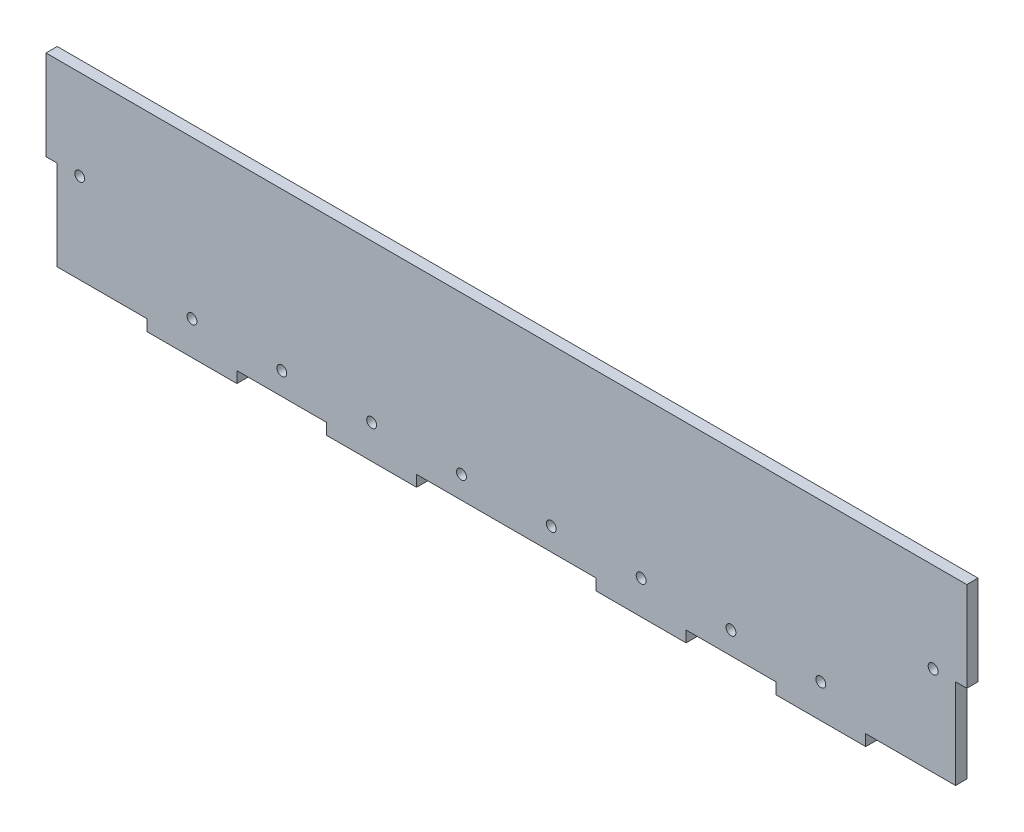
ISO-10303-21;
HEADER;
FILE_DESCRIPTION(('STEP AP214'),'2;1');
FILE_NAME('part.step','',(''),(''),'','','');
FILE_SCHEMA(('AUTOMOTIVE_DESIGN { 1 0 10303 214 1 1 1 1 }'));
ENDSEC;
DATA;
#1=APPLICATION_CONTEXT('core data for automotive mechanical design processes');
#2=APPLICATION_PROTOCOL_DEFINITION('international standard','automotive_design',2000,#1);
#3=PRODUCT_CONTEXT('',#1,'mechanical');
#4=PRODUCT('Part','Part','',(#3));
#5=PRODUCT_RELATED_PRODUCT_CATEGORY('part','',(#4));
#6=PRODUCT_DEFINITION_FORMATION('','',#4);
#7=PRODUCT_DEFINITION_CONTEXT('part definition',#1,'design');
#8=PRODUCT_DEFINITION('design','',#6,#7);
#9=PRODUCT_DEFINITION_SHAPE('','',#8);
#10=(LENGTH_UNIT() NAMED_UNIT(*) SI_UNIT(.MILLI.,.METRE.));
#11=(NAMED_UNIT(*) PLANE_ANGLE_UNIT() SI_UNIT($,.RADIAN.));
#12=(NAMED_UNIT(*) SI_UNIT($,.STERADIAN.) SOLID_ANGLE_UNIT());
#13=UNCERTAINTY_MEASURE_WITH_UNIT(LENGTH_MEASURE(1.E-05),#10,'distance_accuracy_value','');
#14=(GEOMETRIC_REPRESENTATION_CONTEXT(3) GLOBAL_UNCERTAINTY_ASSIGNED_CONTEXT((#13)) GLOBAL_UNIT_ASSIGNED_CONTEXT((#10,
#11,#12)) REPRESENTATION_CONTEXT('',''));
#15=CARTESIAN_POINT('',(0.,0.,0.));
#16=DIRECTION('',(0.,0.,1.));
#17=DIRECTION('',(1.,0.,0.));
#18=AXIS2_PLACEMENT_3D('',#15,#16,#17);
#19=CARTESIAN_POINT('',(0.,-70.,5.));
#20=DIRECTION('',(0.,-1.,0.));
#21=DIRECTION('',(0.,0.,-1.));
#22=AXIS2_PLACEMENT_3D('',#19,#20,#21);
#23=PLANE('',#22);
#24=DIRECTION('',(-1.,0.,0.));
#25=VECTOR('',#24,1.);
#26=CARTESIAN_POINT('',(0.,-70.,0.));
#27=LINE('',#26,#25);
#28=CARTESIAN_POINT('',(205.,-70.,0.));
#29=VERTEX_POINT('',#28);
#30=CARTESIAN_POINT('',(-205.,-70.,0.));
#31=VERTEX_POINT('',#30);
#32=EDGE_CURVE('E139',#29,#31,#27,.T.);
#33=ORIENTED_EDGE('',*,*,#32,.T.);
#34=DIRECTION('',(0.,0.,-1.));
#35=VECTOR('',#34,1.);
#36=CARTESIAN_POINT('',(-205.,-70.,5.));
#37=LINE('',#36,#35);
#38=CARTESIAN_POINT('',(-205.,-70.,5.));
#39=VERTEX_POINT('',#38);
#40=EDGE_CURVE('E11',#39,#31,#37,.T.);
#41=ORIENTED_EDGE('',*,*,#40,.F.);
#42=DIRECTION('',(1.,0.,0.));
#43=VECTOR('',#42,1.);
#44=CARTESIAN_POINT('',(0.,-70.,5.));
#45=LINE('',#44,#43);
#46=CARTESIAN_POINT('',(205.,-70.,5.));
#47=VERTEX_POINT('',#46);
#48=EDGE_CURVE('E146',#39,#47,#45,.T.);
#49=ORIENTED_EDGE('',*,*,#48,.T.);
#50=DIRECTION('',(0.,0.,-1.));
#51=VECTOR('',#50,1.);
#52=CARTESIAN_POINT('',(205.,-70.,5.));
#53=LINE('',#52,#51);
#54=EDGE_CURVE('E59',#47,#29,#53,.T.);
#55=ORIENTED_EDGE('',*,*,#54,.T.);
#56=EDGE_LOOP('',(#33,#41,#49,#55));
#57=FACE_BOUND('',#56,.T.);
#58=ADVANCED_FACE('F41',(#57),#23,.F.);
#59=CARTESIAN_POINT('',(-205.,0.,5.));
#60=DIRECTION('',(1.,0.,0.));
#61=DIRECTION('',(0.,0.,-1.));
#62=AXIS2_PLACEMENT_3D('',#59,#60,#61);
#63=PLANE('',#62);
#64=DIRECTION('',(0.,0.,-1.));
#65=VECTOR('',#64,1.);
#66=CARTESIAN_POINT('',(-205.,-110.,5.));
#67=LINE('',#66,#65);
#68=CARTESIAN_POINT('',(-205.,-110.,5.));
#69=VERTEX_POINT('',#68);
#70=CARTESIAN_POINT('',(-205.,-110.,0.));
#71=VERTEX_POINT('',#70);
#72=EDGE_CURVE('E51',#69,#71,#67,.T.);
#73=ORIENTED_EDGE('',*,*,#72,.F.);
#74=DIRECTION('',(0.,-1.,0.));
#75=VECTOR('',#74,1.);
#76=CARTESIAN_POINT('',(-205.,0.,5.));
#77=LINE('',#76,#75);
#78=EDGE_CURVE('E456',#39,#69,#77,.T.);
#79=ORIENTED_EDGE('',*,*,#78,.F.);
#80=ORIENTED_EDGE('',*,*,#40,.T.);
#81=DIRECTION('',(0.,-1.,0.));
#82=VECTOR('',#81,1.);
#83=CARTESIAN_POINT('',(-205.,0.,0.));
#84=LINE('',#83,#82);
#85=EDGE_CURVE('E283',#31,#71,#84,.T.);
#86=ORIENTED_EDGE('',*,*,#85,.T.);
#87=EDGE_LOOP('',(#73,#79,#80,#86));
#88=FACE_BOUND('',#87,.T.);
#89=ADVANCED_FACE('F455',(#88),#63,.F.);
#90=CARTESIAN_POINT('',(0.,-110.,5.));
#91=DIRECTION('',(0.,1.,0.));
#92=DIRECTION('',(0.,0.,1.));
#93=AXIS2_PLACEMENT_3D('',#90,#91,#92);
#94=PLANE('',#93);
#95=DIRECTION('',(1.,0.,0.));
#96=VECTOR('',#95,1.);
#97=CARTESIAN_POINT('',(0.,-110.,0.));
#98=LINE('',#97,#96);
#99=CARTESIAN_POINT('',(-200.,-110.,0.));
#100=VERTEX_POINT('',#99);
#101=EDGE_CURVE('E286',#71,#100,#98,.T.);
#102=ORIENTED_EDGE('',*,*,#101,.T.);
#103=DIRECTION('',(0.,0.,-1.));
#104=VECTOR('',#103,1.);
#105=CARTESIAN_POINT('',(-200.,-110.,5.));
#106=LINE('',#105,#104);
#107=CARTESIAN_POINT('',(-200.,-110.,5.));
#108=VERTEX_POINT('',#107);
#109=EDGE_CURVE('E443',#108,#100,#106,.T.);
#110=ORIENTED_EDGE('',*,*,#109,.F.);
#111=DIRECTION('',(1.,0.,0.));
#112=VECTOR('',#111,1.);
#113=CARTESIAN_POINT('',(0.,-110.,5.));
#114=LINE('',#113,#112);
#115=EDGE_CURVE('E453',#69,#108,#114,.T.);
#116=ORIENTED_EDGE('',*,*,#115,.F.);
#117=ORIENTED_EDGE('',*,*,#72,.T.);
#118=EDGE_LOOP('',(#102,#110,#116,#117));
#119=FACE_BOUND('',#118,.T.);
#120=ADVANCED_FACE('F450',(#119),#94,.F.);
#121=CARTESIAN_POINT('',(-200.,0.,5.));
#122=DIRECTION('',(-1.,0.,0.));
#123=DIRECTION('',(0.,0.,1.));
#124=AXIS2_PLACEMENT_3D('',#121,#122,#123);
#125=PLANE('',#124);
#126=DIRECTION('',(0.,1.,0.));
#127=VECTOR('',#126,1.);
#128=CARTESIAN_POINT('',(-200.,0.,0.));
#129=LINE('',#128,#127);
#130=CARTESIAN_POINT('',(-200.,-150.,0.));
#131=VERTEX_POINT('',#130);
#132=EDGE_CURVE('E290',#131,#100,#129,.T.);
#133=ORIENTED_EDGE('',*,*,#132,.F.);
#134=DIRECTION('',(0.,0.,-1.));
#135=VECTOR('',#134,1.);
#136=CARTESIAN_POINT('',(-200.,-150.,5.));
#137=LINE('',#136,#135);
#138=CARTESIAN_POINT('',(-200.,-150.,5.));
#139=VERTEX_POINT('',#138);
#140=EDGE_CURVE('E440',#139,#131,#137,.T.);
#141=ORIENTED_EDGE('',*,*,#140,.F.);
#142=DIRECTION('',(0.,1.,0.));
#143=VECTOR('',#142,1.);
#144=CARTESIAN_POINT('',(-200.,0.,5.));
#145=LINE('',#144,#143);
#146=EDGE_CURVE('E467',#139,#108,#145,.T.);
#147=ORIENTED_EDGE('',*,*,#146,.T.);
#148=ORIENTED_EDGE('',*,*,#109,.T.);
#149=EDGE_LOOP('',(#133,#141,#147,#148));
#150=FACE_BOUND('',#149,.T.);
#151=ADVANCED_FACE('F463',(#150),#125,.T.);
#152=CARTESIAN_POINT('',(0.,-150.,5.));
#153=DIRECTION('',(0.,1.,0.));
#154=DIRECTION('',(0.,0.,1.));
#155=AXIS2_PLACEMENT_3D('',#152,#153,#154);
#156=PLANE('',#155);
#157=DIRECTION('',(1.,0.,0.));
#158=VECTOR('',#157,1.);
#159=CARTESIAN_POINT('',(0.,-150.,0.));
#160=LINE('',#159,#158);
#161=CARTESIAN_POINT('',(-160.,-150.,0.));
#162=VERTEX_POINT('',#161);
#163=EDGE_CURVE('E294',#131,#162,#160,.T.);
#164=ORIENTED_EDGE('',*,*,#163,.T.);
#165=DIRECTION('',(0.,0.,-1.));
#166=VECTOR('',#165,1.);
#167=CARTESIAN_POINT('',(-160.,-150.,5.));
#168=LINE('',#167,#166);
#169=CARTESIAN_POINT('',(-160.,-150.,5.));
#170=VERTEX_POINT('',#169);
#171=EDGE_CURVE('E436',#170,#162,#168,.T.);
#172=ORIENTED_EDGE('',*,*,#171,.F.);
#173=DIRECTION('',(1.,0.,0.));
#174=VECTOR('',#173,1.);
#175=CARTESIAN_POINT('',(0.,-150.,5.));
#176=LINE('',#175,#174);
#177=EDGE_CURVE('E470',#139,#170,#176,.T.);
#178=ORIENTED_EDGE('',*,*,#177,.F.);
#179=ORIENTED_EDGE('',*,*,#140,.T.);
#180=EDGE_LOOP('',(#164,#172,#178,#179));
#181=FACE_BOUND('',#180,.T.);
#182=ADVANCED_FACE('F586',(#181),#156,.F.);
#183=CARTESIAN_POINT('',(-160.,0.,5.));
#184=DIRECTION('',(1.,0.,0.));
#185=DIRECTION('',(0.,0.,-1.));
#186=AXIS2_PLACEMENT_3D('',#183,#184,#185);
#187=PLANE('',#186);
#188=DIRECTION('',(0.,-1.,0.));
#189=VECTOR('',#188,1.);
#190=CARTESIAN_POINT('',(-160.,0.,0.));
#191=LINE('',#190,#189);
#192=CARTESIAN_POINT('',(-160.,-155.,0.));
#193=VERTEX_POINT('',#192);
#194=EDGE_CURVE('E298',#162,#193,#191,.T.);
#195=ORIENTED_EDGE('',*,*,#194,.T.);
#196=DIRECTION('',(0.,0.,-1.));
#197=VECTOR('',#196,1.);
#198=CARTESIAN_POINT('',(-160.,-155.,5.));
#199=LINE('',#198,#197);
#200=CARTESIAN_POINT('',(-160.,-155.,5.));
#201=VERTEX_POINT('',#200);
#202=EDGE_CURVE('E432',#201,#193,#199,.T.);
#203=ORIENTED_EDGE('',*,*,#202,.F.);
#204=DIRECTION('',(0.,-1.,0.));
#205=VECTOR('',#204,1.);
#206=CARTESIAN_POINT('',(-160.,0.,5.));
#207=LINE('',#206,#205);
#208=EDGE_CURVE('E474',#170,#201,#207,.T.);
#209=ORIENTED_EDGE('',*,*,#208,.F.);
#210=ORIENTED_EDGE('',*,*,#171,.T.);
#211=EDGE_LOOP('',(#195,#203,#209,#210));
#212=FACE_BOUND('',#211,.T.);
#213=ADVANCED_FACE('F583',(#212),#187,.F.);
#214=CARTESIAN_POINT('',(0.,-155.,5.));
#215=DIRECTION('',(0.,1.,0.));
#216=DIRECTION('',(0.,0.,1.));
#217=AXIS2_PLACEMENT_3D('',#214,#215,#216);
#218=PLANE('',#217);
#219=DIRECTION('',(1.,0.,0.));
#220=VECTOR('',#219,1.);
#221=CARTESIAN_POINT('',(0.,-155.,0.));
#222=LINE('',#221,#220);
#223=CARTESIAN_POINT('',(-120.,-155.,0.));
#224=VERTEX_POINT('',#223);
#225=EDGE_CURVE('E302',#193,#224,#222,.T.);
#226=ORIENTED_EDGE('',*,*,#225,.T.);
#227=DIRECTION('',(0.,0.,-1.));
#228=VECTOR('',#227,1.);
#229=CARTESIAN_POINT('',(-120.,-155.,5.));
#230=LINE('',#229,#228);
#231=CARTESIAN_POINT('',(-120.,-155.,5.));
#232=VERTEX_POINT('',#231);
#233=EDGE_CURVE('E428',#232,#224,#230,.T.);
#234=ORIENTED_EDGE('',*,*,#233,.F.);
#235=DIRECTION('',(1.,0.,0.));
#236=VECTOR('',#235,1.);
#237=CARTESIAN_POINT('',(0.,-155.,5.));
#238=LINE('',#237,#236);
#239=EDGE_CURVE('E482',#201,#232,#238,.T.);
#240=ORIENTED_EDGE('',*,*,#239,.F.);
#241=ORIENTED_EDGE('',*,*,#202,.T.);
#242=EDGE_LOOP('',(#226,#234,#240,#241));
#243=FACE_BOUND('',#242,.T.);
#244=ADVANCED_FACE('F580',(#243),#218,.F.);
#245=CARTESIAN_POINT('',(-120.,0.,5.));
#246=DIRECTION('',(-1.,0.,0.));
#247=DIRECTION('',(0.,0.,1.));
#248=AXIS2_PLACEMENT_3D('',#245,#246,#247);
#249=PLANE('',#248);
#250=DIRECTION('',(0.,1.,0.));
#251=VECTOR('',#250,1.);
#252=CARTESIAN_POINT('',(-120.,0.,0.));
#253=LINE('',#252,#251);
#254=CARTESIAN_POINT('',(-120.,-150.,0.));
#255=VERTEX_POINT('',#254);
#256=EDGE_CURVE('E306',#224,#255,#253,.T.);
#257=ORIENTED_EDGE('',*,*,#256,.T.);
#258=DIRECTION('',(0.,0.,-1.));
#259=VECTOR('',#258,1.);
#260=CARTESIAN_POINT('',(-120.,-150.,5.));
#261=LINE('',#260,#259);
#262=CARTESIAN_POINT('',(-120.,-150.,5.));
#263=VERTEX_POINT('',#262);
#264=EDGE_CURVE('E424',#263,#255,#261,.T.);
#265=ORIENTED_EDGE('',*,*,#264,.F.);
#266=DIRECTION('',(0.,1.,0.));
#267=VECTOR('',#266,1.);
#268=CARTESIAN_POINT('',(-120.,0.,5.));
#269=LINE('',#268,#267);
#270=EDGE_CURVE('E486',#232,#263,#269,.T.);
#271=ORIENTED_EDGE('',*,*,#270,.F.);
#272=ORIENTED_EDGE('',*,*,#233,.T.);
#273=EDGE_LOOP('',(#257,#265,#271,#272));
#274=FACE_BOUND('',#273,.T.);
#275=ADVANCED_FACE('F578',(#274),#249,.F.);
#276=CARTESIAN_POINT('',(0.,-150.,5.));
#277=DIRECTION('',(0.,1.,0.));
#278=DIRECTION('',(0.,0.,1.));
#279=AXIS2_PLACEMENT_3D('',#276,#277,#278);
#280=PLANE('',#279);
#281=DIRECTION('',(1.,0.,0.));
#282=VECTOR('',#281,1.);
#283=CARTESIAN_POINT('',(0.,-150.,0.));
#284=LINE('',#283,#282);
#285=CARTESIAN_POINT('',(-80.,-150.,0.));
#286=VERTEX_POINT('',#285);
#287=EDGE_CURVE('E310',#255,#286,#284,.T.);
#288=ORIENTED_EDGE('',*,*,#287,.T.);
#289=DIRECTION('',(0.,0.,-1.));
#290=VECTOR('',#289,1.);
#291=CARTESIAN_POINT('',(-80.,-150.,5.));
#292=LINE('',#291,#290);
#293=CARTESIAN_POINT('',(-80.,-150.,5.));
#294=VERTEX_POINT('',#293);
#295=EDGE_CURVE('E420',#294,#286,#292,.T.);
#296=ORIENTED_EDGE('',*,*,#295,.F.);
#297=DIRECTION('',(1.,0.,0.));
#298=VECTOR('',#297,1.);
#299=CARTESIAN_POINT('',(0.,-150.,5.));
#300=LINE('',#299,#298);
#301=EDGE_CURVE('E490',#263,#294,#300,.T.);
#302=ORIENTED_EDGE('',*,*,#301,.F.);
#303=ORIENTED_EDGE('',*,*,#264,.T.);
#304=EDGE_LOOP('',(#288,#296,#302,#303));
#305=FACE_BOUND('',#304,.T.);
#306=ADVANCED_FACE('F574',(#305),#280,.F.);
#307=CARTESIAN_POINT('',(-80.,0.,5.));
#308=DIRECTION('',(1.,0.,0.));
#309=DIRECTION('',(0.,0.,-1.));
#310=AXIS2_PLACEMENT_3D('',#307,#308,#309);
#311=PLANE('',#310);
#312=DIRECTION('',(0.,-1.,0.));
#313=VECTOR('',#312,1.);
#314=CARTESIAN_POINT('',(-80.,0.,0.));
#315=LINE('',#314,#313);
#316=CARTESIAN_POINT('',(-80.,-155.,0.));
#317=VERTEX_POINT('',#316);
#318=EDGE_CURVE('E314',#286,#317,#315,.T.);
#319=ORIENTED_EDGE('',*,*,#318,.T.);
#320=DIRECTION('',(0.,0.,-1.));
#321=VECTOR('',#320,1.);
#322=CARTESIAN_POINT('',(-80.,-155.,5.));
#323=LINE('',#322,#321);
#324=CARTESIAN_POINT('',(-80.,-155.,5.));
#325=VERTEX_POINT('',#324);
#326=EDGE_CURVE('E416',#325,#317,#323,.T.);
#327=ORIENTED_EDGE('',*,*,#326,.F.);
#328=DIRECTION('',(0.,-1.,0.));
#329=VECTOR('',#328,1.);
#330=CARTESIAN_POINT('',(-80.,0.,5.));
#331=LINE('',#330,#329);
#332=EDGE_CURVE('E494',#294,#325,#331,.T.);
#333=ORIENTED_EDGE('',*,*,#332,.F.);
#334=ORIENTED_EDGE('',*,*,#295,.T.);
#335=EDGE_LOOP('',(#319,#327,#333,#334));
#336=FACE_BOUND('',#335,.T.);
#337=ADVANCED_FACE('F571',(#336),#311,.F.);
#338=CARTESIAN_POINT('',(0.,-155.,5.));
#339=DIRECTION('',(0.,1.,0.));
#340=DIRECTION('',(0.,0.,1.));
#341=AXIS2_PLACEMENT_3D('',#338,#339,#340);
#342=PLANE('',#341);
#343=DIRECTION('',(1.,0.,0.));
#344=VECTOR('',#343,1.);
#345=CARTESIAN_POINT('',(0.,-155.,0.));
#346=LINE('',#345,#344);
#347=CARTESIAN_POINT('',(-40.,-155.,0.));
#348=VERTEX_POINT('',#347);
#349=EDGE_CURVE('E318',#317,#348,#346,.T.);
#350=ORIENTED_EDGE('',*,*,#349,.T.);
#351=DIRECTION('',(0.,0.,-1.));
#352=VECTOR('',#351,1.);
#353=CARTESIAN_POINT('',(-40.,-155.,5.));
#354=LINE('',#353,#352);
#355=CARTESIAN_POINT('',(-40.,-155.,5.));
#356=VERTEX_POINT('',#355);
#357=EDGE_CURVE('E412',#356,#348,#354,.T.);
#358=ORIENTED_EDGE('',*,*,#357,.F.);
#359=DIRECTION('',(1.,0.,0.));
#360=VECTOR('',#359,1.);
#361=CARTESIAN_POINT('',(0.,-155.,5.));
#362=LINE('',#361,#360);
#363=EDGE_CURVE('E498',#325,#356,#362,.T.);
#364=ORIENTED_EDGE('',*,*,#363,.F.);
#365=ORIENTED_EDGE('',*,*,#326,.T.);
#366=EDGE_LOOP('',(#350,#358,#364,#365));
#367=FACE_BOUND('',#366,.T.);
#368=ADVANCED_FACE('F569',(#367),#342,.F.);
#369=CARTESIAN_POINT('',(-39.9999999999998,0.,5.));
#370=DIRECTION('',(-1.,0.,0.));
#371=DIRECTION('',(0.,-1.,0.));
#372=AXIS2_PLACEMENT_3D('',#369,#370,#371);
#373=PLANE('',#372);
#374=DIRECTION('',(0.,1.,0.));
#375=VECTOR('',#374,1.);
#376=CARTESIAN_POINT('',(-39.9999999999998,0.,0.));
#377=LINE('',#376,#375);
#378=CARTESIAN_POINT('',(-40.,-150.,0.));
#379=VERTEX_POINT('',#378);
#380=EDGE_CURVE('E322',#348,#379,#377,.T.);
#381=ORIENTED_EDGE('',*,*,#380,.T.);
#382=DIRECTION('',(0.,0.,-1.));
#383=VECTOR('',#382,1.);
#384=CARTESIAN_POINT('',(-40.,-150.,5.));
#385=LINE('',#384,#383);
#386=CARTESIAN_POINT('',(-40.,-150.,5.));
#387=VERTEX_POINT('',#386);
#388=EDGE_CURVE('E408',#387,#379,#385,.T.);
#389=ORIENTED_EDGE('',*,*,#388,.F.);
#390=DIRECTION('',(0.,1.,0.));
#391=VECTOR('',#390,1.);
#392=CARTESIAN_POINT('',(-39.9999999999998,0.,5.));
#393=LINE('',#392,#391);
#394=EDGE_CURVE('E502',#356,#387,#393,.T.);
#395=ORIENTED_EDGE('',*,*,#394,.F.);
#396=ORIENTED_EDGE('',*,*,#357,.T.);
#397=EDGE_LOOP('',(#381,#389,#395,#396));
#398=FACE_BOUND('',#397,.T.);
#399=ADVANCED_FACE('F565',(#398),#373,.F.);
#400=CARTESIAN_POINT('',(0.,-150.,5.));
#401=DIRECTION('',(0.,1.,0.));
#402=DIRECTION('',(0.,0.,1.));
#403=AXIS2_PLACEMENT_3D('',#400,#401,#402);
#404=PLANE('',#403);
#405=DIRECTION('',(1.,0.,0.));
#406=VECTOR('',#405,1.);
#407=CARTESIAN_POINT('',(0.,-150.,0.));
#408=LINE('',#407,#406);
#409=CARTESIAN_POINT('',(40.,-150.,0.));
#410=VERTEX_POINT('',#409);
#411=EDGE_CURVE('E326',#379,#410,#408,.T.);
#412=ORIENTED_EDGE('',*,*,#411,.T.);
#413=DIRECTION('',(0.,0.,-1.));
#414=VECTOR('',#413,1.);
#415=CARTESIAN_POINT('',(40.,-150.,5.));
#416=LINE('',#415,#414);
#417=CARTESIAN_POINT('',(40.,-150.,5.));
#418=VERTEX_POINT('',#417);
#419=EDGE_CURVE('E404',#418,#410,#416,.T.);
#420=ORIENTED_EDGE('',*,*,#419,.F.);
#421=DIRECTION('',(1.,0.,0.));
#422=VECTOR('',#421,1.);
#423=CARTESIAN_POINT('',(0.,-150.,5.));
#424=LINE('',#423,#422);
#425=EDGE_CURVE('E506',#387,#418,#424,.T.);
#426=ORIENTED_EDGE('',*,*,#425,.F.);
#427=ORIENTED_EDGE('',*,*,#388,.T.);
#428=EDGE_LOOP('',(#412,#420,#426,#427));
#429=FACE_BOUND('',#428,.T.);
#430=ADVANCED_FACE('F562',(#429),#404,.F.);
#431=CARTESIAN_POINT('',(40.,0.,5.));
#432=DIRECTION('',(1.,0.,0.));
#433=DIRECTION('',(0.,0.,-1.));
#434=AXIS2_PLACEMENT_3D('',#431,#432,#433);
#435=PLANE('',#434);
#436=DIRECTION('',(0.,-1.,0.));
#437=VECTOR('',#436,1.);
#438=CARTESIAN_POINT('',(40.,0.,0.));
#439=LINE('',#438,#437);
#440=CARTESIAN_POINT('',(40.,-155.,0.));
#441=VERTEX_POINT('',#440);
#442=EDGE_CURVE('E330',#410,#441,#439,.T.);
#443=ORIENTED_EDGE('',*,*,#442,.T.);
#444=DIRECTION('',(0.,0.,-1.));
#445=VECTOR('',#444,1.);
#446=CARTESIAN_POINT('',(40.,-155.,5.));
#447=LINE('',#446,#445);
#448=CARTESIAN_POINT('',(40.,-155.,5.));
#449=VERTEX_POINT('',#448);
#450=EDGE_CURVE('E400',#449,#441,#447,.T.);
#451=ORIENTED_EDGE('',*,*,#450,.F.);
#452=DIRECTION('',(0.,-1.,0.));
#453=VECTOR('',#452,1.);
#454=CARTESIAN_POINT('',(40.,0.,5.));
#455=LINE('',#454,#453);
#456=EDGE_CURVE('E510',#418,#449,#455,.T.);
#457=ORIENTED_EDGE('',*,*,#456,.F.);
#458=ORIENTED_EDGE('',*,*,#419,.T.);
#459=EDGE_LOOP('',(#443,#451,#457,#458));
#460=FACE_BOUND('',#459,.T.);
#461=ADVANCED_FACE('F560',(#460),#435,.F.);
#462=CARTESIAN_POINT('',(0.,-155.,5.));
#463=DIRECTION('',(0.,1.,0.));
#464=DIRECTION('',(0.,0.,1.));
#465=AXIS2_PLACEMENT_3D('',#462,#463,#464);
#466=PLANE('',#465);
#467=DIRECTION('',(1.,0.,0.));
#468=VECTOR('',#467,1.);
#469=CARTESIAN_POINT('',(0.,-155.,0.));
#470=LINE('',#469,#468);
#471=CARTESIAN_POINT('',(80.,-155.,0.));
#472=VERTEX_POINT('',#471);
#473=EDGE_CURVE('E334',#441,#472,#470,.T.);
#474=ORIENTED_EDGE('',*,*,#473,.T.);
#475=DIRECTION('',(0.,0.,-1.));
#476=VECTOR('',#475,1.);
#477=CARTESIAN_POINT('',(80.,-155.,5.));
#478=LINE('',#477,#476);
#479=CARTESIAN_POINT('',(80.,-155.,5.));
#480=VERTEX_POINT('',#479);
#481=EDGE_CURVE('E396',#480,#472,#478,.T.);
#482=ORIENTED_EDGE('',*,*,#481,.F.);
#483=DIRECTION('',(1.,0.,0.));
#484=VECTOR('',#483,1.);
#485=CARTESIAN_POINT('',(0.,-155.,5.));
#486=LINE('',#485,#484);
#487=EDGE_CURVE('E514',#449,#480,#486,.T.);
#488=ORIENTED_EDGE('',*,*,#487,.F.);
#489=ORIENTED_EDGE('',*,*,#450,.T.);
#490=EDGE_LOOP('',(#474,#482,#488,#489));
#491=FACE_BOUND('',#490,.T.);
#492=ADVANCED_FACE('F556',(#491),#466,.F.);
#493=CARTESIAN_POINT('',(80.,0.,5.));
#494=DIRECTION('',(-1.,0.,0.));
#495=DIRECTION('',(0.,0.,1.));
#496=AXIS2_PLACEMENT_3D('',#493,#494,#495);
#497=PLANE('',#496);
#498=DIRECTION('',(0.,1.,0.));
#499=VECTOR('',#498,1.);
#500=CARTESIAN_POINT('',(80.,0.,0.));
#501=LINE('',#500,#499);
#502=CARTESIAN_POINT('',(80.,-150.,0.));
#503=VERTEX_POINT('',#502);
#504=EDGE_CURVE('E338',#472,#503,#501,.T.);
#505=ORIENTED_EDGE('',*,*,#504,.T.);
#506=DIRECTION('',(0.,0.,-1.));
#507=VECTOR('',#506,1.);
#508=CARTESIAN_POINT('',(80.,-150.,5.));
#509=LINE('',#508,#507);
#510=CARTESIAN_POINT('',(80.,-150.,5.));
#511=VERTEX_POINT('',#510);
#512=EDGE_CURVE('E392',#511,#503,#509,.T.);
#513=ORIENTED_EDGE('',*,*,#512,.F.);
#514=DIRECTION('',(0.,1.,0.));
#515=VECTOR('',#514,1.);
#516=CARTESIAN_POINT('',(80.,0.,5.));
#517=LINE('',#516,#515);
#518=EDGE_CURVE('E518',#480,#511,#517,.T.);
#519=ORIENTED_EDGE('',*,*,#518,.F.);
#520=ORIENTED_EDGE('',*,*,#481,.T.);
#521=EDGE_LOOP('',(#505,#513,#519,#520));
#522=FACE_BOUND('',#521,.T.);
#523=ADVANCED_FACE('F553',(#522),#497,.F.);
#524=CARTESIAN_POINT('',(0.,-150.,5.));
#525=DIRECTION('',(0.,1.,0.));
#526=DIRECTION('',(0.,0.,1.));
#527=AXIS2_PLACEMENT_3D('',#524,#525,#526);
#528=PLANE('',#527);
#529=DIRECTION('',(1.,0.,0.));
#530=VECTOR('',#529,1.);
#531=CARTESIAN_POINT('',(0.,-150.,0.));
#532=LINE('',#531,#530);
#533=CARTESIAN_POINT('',(120.,-150.,0.));
#534=VERTEX_POINT('',#533);
#535=EDGE_CURVE('E342',#503,#534,#532,.T.);
#536=ORIENTED_EDGE('',*,*,#535,.T.);
#537=DIRECTION('',(0.,0.,-1.));
#538=VECTOR('',#537,1.);
#539=CARTESIAN_POINT('',(120.,-150.,5.));
#540=LINE('',#539,#538);
#541=CARTESIAN_POINT('',(120.,-150.,5.));
#542=VERTEX_POINT('',#541);
#543=EDGE_CURVE('E388',#542,#534,#540,.T.);
#544=ORIENTED_EDGE('',*,*,#543,.F.);
#545=DIRECTION('',(1.,0.,0.));
#546=VECTOR('',#545,1.);
#547=CARTESIAN_POINT('',(0.,-150.,5.));
#548=LINE('',#547,#546);
#549=EDGE_CURVE('E522',#511,#542,#548,.T.);
#550=ORIENTED_EDGE('',*,*,#549,.F.);
#551=ORIENTED_EDGE('',*,*,#512,.T.);
#552=EDGE_LOOP('',(#536,#544,#550,#551));
#553=FACE_BOUND('',#552,.T.);
#554=ADVANCED_FACE('F551',(#553),#528,.F.);
#555=CARTESIAN_POINT('',(120.,0.,5.));
#556=DIRECTION('',(1.,0.,0.));
#557=DIRECTION('',(0.,0.,-1.));
#558=AXIS2_PLACEMENT_3D('',#555,#556,#557);
#559=PLANE('',#558);
#560=DIRECTION('',(0.,-1.,0.));
#561=VECTOR('',#560,1.);
#562=CARTESIAN_POINT('',(120.,0.,0.));
#563=LINE('',#562,#561);
#564=CARTESIAN_POINT('',(120.,-155.,0.));
#565=VERTEX_POINT('',#564);
#566=EDGE_CURVE('E346',#534,#565,#563,.T.);
#567=ORIENTED_EDGE('',*,*,#566,.T.);
#568=DIRECTION('',(0.,0.,-1.));
#569=VECTOR('',#568,1.);
#570=CARTESIAN_POINT('',(120.,-155.,5.));
#571=LINE('',#570,#569);
#572=CARTESIAN_POINT('',(120.,-155.,5.));
#573=VERTEX_POINT('',#572);
#574=EDGE_CURVE('E384',#573,#565,#571,.T.);
#575=ORIENTED_EDGE('',*,*,#574,.F.);
#576=DIRECTION('',(0.,-1.,0.));
#577=VECTOR('',#576,1.);
#578=CARTESIAN_POINT('',(120.,0.,5.));
#579=LINE('',#578,#577);
#580=EDGE_CURVE('E526',#542,#573,#579,.T.);
#581=ORIENTED_EDGE('',*,*,#580,.F.);
#582=ORIENTED_EDGE('',*,*,#543,.T.);
#583=EDGE_LOOP('',(#567,#575,#581,#582));
#584=FACE_BOUND('',#583,.T.);
#585=ADVANCED_FACE('F547',(#584),#559,.F.);
#586=CARTESIAN_POINT('',(0.,-155.,5.));
#587=DIRECTION('',(0.,1.,0.));
#588=DIRECTION('',(0.,0.,1.));
#589=AXIS2_PLACEMENT_3D('',#586,#587,#588);
#590=PLANE('',#589);
#591=DIRECTION('',(1.,0.,0.));
#592=VECTOR('',#591,1.);
#593=CARTESIAN_POINT('',(0.,-155.,0.));
#594=LINE('',#593,#592);
#595=CARTESIAN_POINT('',(160.,-155.,0.));
#596=VERTEX_POINT('',#595);
#597=EDGE_CURVE('E350',#565,#596,#594,.T.);
#598=ORIENTED_EDGE('',*,*,#597,.T.);
#599=DIRECTION('',(0.,0.,-1.));
#600=VECTOR('',#599,1.);
#601=CARTESIAN_POINT('',(160.,-155.,5.));
#602=LINE('',#601,#600);
#603=CARTESIAN_POINT('',(160.,-155.,5.));
#604=VERTEX_POINT('',#603);
#605=EDGE_CURVE('E380',#604,#596,#602,.T.);
#606=ORIENTED_EDGE('',*,*,#605,.F.);
#607=DIRECTION('',(1.,0.,0.));
#608=VECTOR('',#607,1.);
#609=CARTESIAN_POINT('',(0.,-155.,5.));
#610=LINE('',#609,#608);
#611=EDGE_CURVE('E530',#573,#604,#610,.T.);
#612=ORIENTED_EDGE('',*,*,#611,.F.);
#613=ORIENTED_EDGE('',*,*,#574,.T.);
#614=EDGE_LOOP('',(#598,#606,#612,#613));
#615=FACE_BOUND('',#614,.T.);
#616=ADVANCED_FACE('F544',(#615),#590,.F.);
#617=CARTESIAN_POINT('',(160.,0.,5.));
#618=DIRECTION('',(-1.,0.,0.));
#619=DIRECTION('',(0.,0.,1.));
#620=AXIS2_PLACEMENT_3D('',#617,#618,#619);
#621=PLANE('',#620);
#622=DIRECTION('',(0.,1.,0.));
#623=VECTOR('',#622,1.);
#624=CARTESIAN_POINT('',(160.,0.,0.));
#625=LINE('',#624,#623);
#626=CARTESIAN_POINT('',(160.,-150.,0.));
#627=VERTEX_POINT('',#626);
#628=EDGE_CURVE('E354',#596,#627,#625,.T.);
#629=ORIENTED_EDGE('',*,*,#628,.T.);
#630=DIRECTION('',(0.,0.,-1.));
#631=VECTOR('',#630,1.);
#632=CARTESIAN_POINT('',(160.,-150.,5.));
#633=LINE('',#632,#631);
#634=CARTESIAN_POINT('',(160.,-150.,5.));
#635=VERTEX_POINT('',#634);
#636=EDGE_CURVE('E376',#635,#627,#633,.T.);
#637=ORIENTED_EDGE('',*,*,#636,.F.);
#638=DIRECTION('',(0.,1.,0.));
#639=VECTOR('',#638,1.);
#640=CARTESIAN_POINT('',(160.,0.,5.));
#641=LINE('',#640,#639);
#642=EDGE_CURVE('E534',#604,#635,#641,.T.);
#643=ORIENTED_EDGE('',*,*,#642,.F.);
#644=ORIENTED_EDGE('',*,*,#605,.T.);
#645=EDGE_LOOP('',(#629,#637,#643,#644));
#646=FACE_BOUND('',#645,.T.);
#647=ADVANCED_FACE('F540',(#646),#621,.F.);
#648=CARTESIAN_POINT('',(0.,-150.,5.));
#649=DIRECTION('',(0.,1.,0.));
#650=DIRECTION('',(0.,0.,1.));
#651=AXIS2_PLACEMENT_3D('',#648,#649,#650);
#652=PLANE('',#651);
#653=DIRECTION('',(1.,0.,0.));
#654=VECTOR('',#653,1.);
#655=CARTESIAN_POINT('',(0.,-150.,0.));
#656=LINE('',#655,#654);
#657=CARTESIAN_POINT('',(200.,-150.,0.));
#658=VERTEX_POINT('',#657);
#659=EDGE_CURVE('E358',#627,#658,#656,.T.);
#660=ORIENTED_EDGE('',*,*,#659,.T.);
#661=DIRECTION('',(0.,0.,-1.));
#662=VECTOR('',#661,1.);
#663=CARTESIAN_POINT('',(200.,-150.,5.));
#664=LINE('',#663,#662);
#665=CARTESIAN_POINT('',(200.,-150.,5.));
#666=VERTEX_POINT('',#665);
#667=EDGE_CURVE('E229',#666,#658,#664,.T.);
#668=ORIENTED_EDGE('',*,*,#667,.F.);
#669=DIRECTION('',(1.,0.,0.));
#670=VECTOR('',#669,1.);
#671=CARTESIAN_POINT('',(0.,-150.,5.));
#672=LINE('',#671,#670);
#673=EDGE_CURVE('E216',#635,#666,#672,.T.);
#674=ORIENTED_EDGE('',*,*,#673,.F.);
#675=ORIENTED_EDGE('',*,*,#636,.T.);
#676=EDGE_LOOP('',(#660,#668,#674,#675));
#677=FACE_BOUND('',#676,.T.);
#678=ADVANCED_FACE('F542',(#677),#652,.F.);
#679=CARTESIAN_POINT('',(200.,0.,5.));
#680=DIRECTION('',(-1.,0.,0.));
#681=DIRECTION('',(0.,0.,1.));
#682=AXIS2_PLACEMENT_3D('',#679,#680,#681);
#683=PLANE('',#682);
#684=DIRECTION('',(0.,1.,0.));
#685=VECTOR('',#684,1.);
#686=CARTESIAN_POINT('',(200.,0.,0.));
#687=LINE('',#686,#685);
#688=CARTESIAN_POINT('',(200.,-110.,0.));
#689=VERTEX_POINT('',#688);
#690=EDGE_CURVE('E225',#658,#689,#687,.T.);
#691=ORIENTED_EDGE('',*,*,#690,.T.);
#692=DIRECTION('',(0.,0.,-1.));
#693=VECTOR('',#692,1.);
#694=CARTESIAN_POINT('',(200.,-110.,5.));
#695=LINE('',#694,#693);
#696=CARTESIAN_POINT('',(200.,-110.,5.));
#697=VERTEX_POINT('',#696);
#698=EDGE_CURVE('E223',#697,#689,#695,.T.);
#699=ORIENTED_EDGE('',*,*,#698,.F.);
#700=DIRECTION('',(0.,1.,0.));
#701=VECTOR('',#700,1.);
#702=CARTESIAN_POINT('',(200.,0.,5.));
#703=LINE('',#702,#701);
#704=EDGE_CURVE('E209',#666,#697,#703,.T.);
#705=ORIENTED_EDGE('',*,*,#704,.F.);
#706=ORIENTED_EDGE('',*,*,#667,.T.);
#707=EDGE_LOOP('',(#691,#699,#705,#706));
#708=FACE_BOUND('',#707,.T.);
#709=ADVANCED_FACE('F224',(#708),#683,.F.);
#710=CARTESIAN_POINT('',(0.,-110.,5.));
#711=DIRECTION('',(0.,-1.,0.));
#712=DIRECTION('',(0.,0.,-1.));
#713=AXIS2_PLACEMENT_3D('',#710,#711,#712);
#714=PLANE('',#713);
#715=DIRECTION('',(-1.,0.,0.));
#716=VECTOR('',#715,1.);
#717=CARTESIAN_POINT('',(0.,-110.,0.));
#718=LINE('',#717,#716);
#719=CARTESIAN_POINT('',(205.,-110.,0.));
#720=VERTEX_POINT('',#719);
#721=EDGE_CURVE('E364',#720,#689,#718,.T.);
#722=ORIENTED_EDGE('',*,*,#721,.F.);
#723=DIRECTION('',(0.,0.,-1.));
#724=VECTOR('',#723,1.);
#725=CARTESIAN_POINT('',(205.,-110.,5.));
#726=LINE('',#725,#724);
#727=CARTESIAN_POINT('',(205.,-110.,5.));
#728=VERTEX_POINT('',#727);
#729=EDGE_CURVE('E230',#728,#720,#726,.T.);
#730=ORIENTED_EDGE('',*,*,#729,.F.);
#731=DIRECTION('',(-1.,0.,0.));
#732=VECTOR('',#731,1.);
#733=CARTESIAN_POINT('',(0.,-110.,5.));
#734=LINE('',#733,#732);
#735=EDGE_CURVE('E214',#728,#697,#734,.T.);
#736=ORIENTED_EDGE('',*,*,#735,.T.);
#737=ORIENTED_EDGE('',*,*,#698,.T.);
#738=EDGE_LOOP('',(#722,#730,#736,#737));
#739=FACE_BOUND('',#738,.T.);
#740=ADVANCED_FACE('F233',(#739),#714,.T.);
#741=CARTESIAN_POINT('',(205.,0.,5.));
#742=DIRECTION('',(1.,0.,0.));
#743=DIRECTION('',(0.,0.,-1.));
#744=AXIS2_PLACEMENT_3D('',#741,#742,#743);
#745=PLANE('',#744);
#746=ORIENTED_EDGE('',*,*,#729,.T.);
#747=DIRECTION('',(0.,-1.,0.));
#748=VECTOR('',#747,1.);
#749=CARTESIAN_POINT('',(205.,0.,0.));
#750=LINE('',#749,#748);
#751=EDGE_CURVE('E135',#29,#720,#750,.T.);
#752=ORIENTED_EDGE('',*,*,#751,.F.);
#753=ORIENTED_EDGE('',*,*,#54,.F.);
#754=DIRECTION('',(0.,-1.,0.));
#755=VECTOR('',#754,1.);
#756=CARTESIAN_POINT('',(205.,0.,5.));
#757=LINE('',#756,#755);
#758=EDGE_CURVE('E235',#47,#728,#757,.T.);
#759=ORIENTED_EDGE('',*,*,#758,.T.);
#760=EDGE_LOOP('',(#746,#752,#753,#759));
#761=FACE_BOUND('',#760,.T.);
#762=ADVANCED_FACE('F610',(#761),#745,.T.);
#763=CARTESIAN_POINT('',(-140.,-140.,5.));
#764=DIRECTION('',(0.,0.,-1.));
#765=DIRECTION('',(-1.,0.,0.));
#766=AXIS2_PLACEMENT_3D('',#763,#764,#765);
#767=CYLINDRICAL_SURFACE('',#766,2.20000000000001);
#768=CARTESIAN_POINT('',(-140.,-140.,5.));
#769=DIRECTION('',(0.,0.,1.));
#770=DIRECTION('',(1.,0.,0.));
#771=AXIS2_PLACEMENT_3D('',#768,#769,#770);
#772=CIRCLE('',#771,2.20000000000001);
#773=CARTESIAN_POINT('',(-137.8,-140.,5.));
#774=VERTEX_POINT('',#773);
#775=EDGE_CURVE('E971',#774,#774,#772,.T.);
#776=ORIENTED_EDGE('',*,*,#775,.T.);
#777=EDGE_LOOP('',(#776));
#778=FACE_BOUND('',#777,.T.);
#779=CARTESIAN_POINT('',(-140.,-140.,0.));
#780=DIRECTION('',(0.,0.,1.));
#781=DIRECTION('',(1.,0.,0.));
#782=AXIS2_PLACEMENT_3D('',#779,#780,#781);
#783=CIRCLE('',#782,2.20000000000001);
#784=CARTESIAN_POINT('',(-137.8,-140.,0.));
#785=VERTEX_POINT('',#784);
#786=EDGE_CURVE('E277',#785,#785,#783,.T.);
#787=ORIENTED_EDGE('',*,*,#786,.F.);
#788=EDGE_LOOP('',(#787));
#789=FACE_BOUND('',#788,.T.);
#790=ADVANCED_FACE('F606',(#778,#789),#767,.F.);
#791=CARTESIAN_POINT('',(-100.,-140.,5.));
#792=DIRECTION('',(0.,0.,-1.));
#793=DIRECTION('',(-1.,0.,0.));
#794=AXIS2_PLACEMENT_3D('',#791,#792,#793);
#795=CYLINDRICAL_SURFACE('',#794,2.20000000000001);
#796=CARTESIAN_POINT('',(-100.,-140.,5.));
#797=DIRECTION('',(0.,0.,1.));
#798=DIRECTION('',(1.,0.,0.));
#799=AXIS2_PLACEMENT_3D('',#796,#797,#798);
#800=CIRCLE('',#799,2.20000000000001);
#801=CARTESIAN_POINT('',(-97.8,-140.,5.));
#802=VERTEX_POINT('',#801);
#803=EDGE_CURVE('E967',#802,#802,#800,.T.);
#804=ORIENTED_EDGE('',*,*,#803,.T.);
#805=EDGE_LOOP('',(#804));
#806=FACE_BOUND('',#805,.T.);
#807=CARTESIAN_POINT('',(-100.,-140.,0.));
#808=DIRECTION('',(0.,0.,1.));
#809=DIRECTION('',(1.,0.,0.));
#810=AXIS2_PLACEMENT_3D('',#807,#808,#809);
#811=CIRCLE('',#810,2.20000000000001);
#812=CARTESIAN_POINT('',(-97.8,-140.,0.));
#813=VERTEX_POINT('',#812);
#814=EDGE_CURVE('E273',#813,#813,#811,.T.);
#815=ORIENTED_EDGE('',*,*,#814,.F.);
#816=EDGE_LOOP('',(#815));
#817=FACE_BOUND('',#816,.T.);
#818=ADVANCED_FACE('F609',(#806,#817),#795,.F.);
#819=CARTESIAN_POINT('',(-60.,-140.,5.));
#820=DIRECTION('',(0.,0.,-1.));
#821=DIRECTION('',(-1.,0.,0.));
#822=AXIS2_PLACEMENT_3D('',#819,#820,#821);
#823=CYLINDRICAL_SURFACE('',#822,2.20000000000001);
#824=CARTESIAN_POINT('',(-60.,-140.,5.));
#825=DIRECTION('',(0.,0.,1.));
#826=DIRECTION('',(1.,0.,0.));
#827=AXIS2_PLACEMENT_3D('',#824,#825,#826);
#828=CIRCLE('',#827,2.20000000000001);
#829=CARTESIAN_POINT('',(-57.8,-140.,5.));
#830=VERTEX_POINT('',#829);
#831=EDGE_CURVE('E963',#830,#830,#828,.T.);
#832=ORIENTED_EDGE('',*,*,#831,.T.);
#833=EDGE_LOOP('',(#832));
#834=FACE_BOUND('',#833,.T.);
#835=CARTESIAN_POINT('',(-60.,-140.,0.));
#836=DIRECTION('',(0.,0.,1.));
#837=DIRECTION('',(1.,0.,0.));
#838=AXIS2_PLACEMENT_3D('',#835,#836,#837);
#839=CIRCLE('',#838,2.20000000000001);
#840=CARTESIAN_POINT('',(-57.8,-140.,0.));
#841=VERTEX_POINT('',#840);
#842=EDGE_CURVE('E269',#841,#841,#839,.T.);
#843=ORIENTED_EDGE('',*,*,#842,.F.);
#844=EDGE_LOOP('',(#843));
#845=FACE_BOUND('',#844,.T.);
#846=ADVANCED_FACE('F614',(#834,#845),#823,.F.);
#847=CARTESIAN_POINT('',(-20.,-140.,5.));
#848=DIRECTION('',(0.,0.,-1.));
#849=DIRECTION('',(-1.,0.,0.));
#850=AXIS2_PLACEMENT_3D('',#847,#848,#849);
#851=CYLINDRICAL_SURFACE('',#850,2.20000000000001);
#852=CARTESIAN_POINT('',(-20.,-140.,5.));
#853=DIRECTION('',(0.,0.,1.));
#854=DIRECTION('',(1.,0.,0.));
#855=AXIS2_PLACEMENT_3D('',#852,#853,#854);
#856=CIRCLE('',#855,2.20000000000001);
#857=CARTESIAN_POINT('',(-17.8,-140.,5.));
#858=VERTEX_POINT('',#857);
#859=EDGE_CURVE('E959',#858,#858,#856,.T.);
#860=ORIENTED_EDGE('',*,*,#859,.T.);
#861=EDGE_LOOP('',(#860));
#862=FACE_BOUND('',#861,.T.);
#863=CARTESIAN_POINT('',(-20.,-140.,0.));
#864=DIRECTION('',(0.,0.,1.));
#865=DIRECTION('',(1.,0.,0.));
#866=AXIS2_PLACEMENT_3D('',#863,#864,#865);
#867=CIRCLE('',#866,2.20000000000001);
#868=CARTESIAN_POINT('',(-17.8,-140.,0.));
#869=VERTEX_POINT('',#868);
#870=EDGE_CURVE('E265',#869,#869,#867,.T.);
#871=ORIENTED_EDGE('',*,*,#870,.F.);
#872=EDGE_LOOP('',(#871));
#873=FACE_BOUND('',#872,.T.);
#874=ADVANCED_FACE('F618',(#862,#873),#851,.F.);
#875=CARTESIAN_POINT('',(20.,-140.,5.));
#876=DIRECTION('',(0.,0.,-1.));
#877=DIRECTION('',(-1.,0.,0.));
#878=AXIS2_PLACEMENT_3D('',#875,#876,#877);
#879=CYLINDRICAL_SURFACE('',#878,2.20000000000001);
#880=CARTESIAN_POINT('',(20.,-140.,5.));
#881=DIRECTION('',(0.,0.,1.));
#882=DIRECTION('',(1.,0.,0.));
#883=AXIS2_PLACEMENT_3D('',#880,#881,#882);
#884=CIRCLE('',#883,2.20000000000001);
#885=CARTESIAN_POINT('',(22.2,-140.,5.));
#886=VERTEX_POINT('',#885);
#887=EDGE_CURVE('E955',#886,#886,#884,.T.);
#888=ORIENTED_EDGE('',*,*,#887,.T.);
#889=EDGE_LOOP('',(#888));
#890=FACE_BOUND('',#889,.T.);
#891=CARTESIAN_POINT('',(20.,-140.,0.));
#892=DIRECTION('',(0.,0.,1.));
#893=DIRECTION('',(1.,0.,0.));
#894=AXIS2_PLACEMENT_3D('',#891,#892,#893);
#895=CIRCLE('',#894,2.20000000000001);
#896=CARTESIAN_POINT('',(22.2,-140.,0.));
#897=VERTEX_POINT('',#896);
#898=EDGE_CURVE('E261',#897,#897,#895,.T.);
#899=ORIENTED_EDGE('',*,*,#898,.F.);
#900=EDGE_LOOP('',(#899));
#901=FACE_BOUND('',#900,.T.);
#902=ADVANCED_FACE('F622',(#890,#901),#879,.F.);
#903=CARTESIAN_POINT('',(60.,-140.,5.));
#904=DIRECTION('',(0.,0.,-1.));
#905=DIRECTION('',(-1.,0.,0.));
#906=AXIS2_PLACEMENT_3D('',#903,#904,#905);
#907=CYLINDRICAL_SURFACE('',#906,2.20000000000001);
#908=CARTESIAN_POINT('',(60.,-140.,5.));
#909=DIRECTION('',(0.,0.,1.));
#910=DIRECTION('',(1.,0.,0.));
#911=AXIS2_PLACEMENT_3D('',#908,#909,#910);
#912=CIRCLE('',#911,2.20000000000001);
#913=CARTESIAN_POINT('',(62.2,-140.,5.));
#914=VERTEX_POINT('',#913);
#915=EDGE_CURVE('E951',#914,#914,#912,.T.);
#916=ORIENTED_EDGE('',*,*,#915,.T.);
#917=EDGE_LOOP('',(#916));
#918=FACE_BOUND('',#917,.T.);
#919=CARTESIAN_POINT('',(60.,-140.,0.));
#920=DIRECTION('',(0.,0.,1.));
#921=DIRECTION('',(1.,0.,0.));
#922=AXIS2_PLACEMENT_3D('',#919,#920,#921);
#923=CIRCLE('',#922,2.20000000000001);
#924=CARTESIAN_POINT('',(62.2,-140.,0.));
#925=VERTEX_POINT('',#924);
#926=EDGE_CURVE('E257',#925,#925,#923,.T.);
#927=ORIENTED_EDGE('',*,*,#926,.F.);
#928=EDGE_LOOP('',(#927));
#929=FACE_BOUND('',#928,.T.);
#930=ADVANCED_FACE('F626',(#918,#929),#907,.F.);
#931=CARTESIAN_POINT('',(100.,-140.,5.));
#932=DIRECTION('',(0.,0.,-1.));
#933=DIRECTION('',(-1.,0.,0.));
#934=AXIS2_PLACEMENT_3D('',#931,#932,#933);
#935=CYLINDRICAL_SURFACE('',#934,2.20000000000001);
#936=CARTESIAN_POINT('',(100.,-140.,5.));
#937=DIRECTION('',(0.,0.,1.));
#938=DIRECTION('',(1.,0.,0.));
#939=AXIS2_PLACEMENT_3D('',#936,#937,#938);
#940=CIRCLE('',#939,2.20000000000001);
#941=CARTESIAN_POINT('',(102.2,-140.,5.));
#942=VERTEX_POINT('',#941);
#943=EDGE_CURVE('E943',#942,#942,#940,.T.);
#944=ORIENTED_EDGE('',*,*,#943,.T.);
#945=EDGE_LOOP('',(#944));
#946=FACE_BOUND('',#945,.T.);
#947=CARTESIAN_POINT('',(100.,-140.,0.));
#948=DIRECTION('',(0.,0.,1.));
#949=DIRECTION('',(1.,0.,0.));
#950=AXIS2_PLACEMENT_3D('',#947,#948,#949);
#951=CIRCLE('',#950,2.20000000000001);
#952=CARTESIAN_POINT('',(102.2,-140.,0.));
#953=VERTEX_POINT('',#952);
#954=EDGE_CURVE('E253',#953,#953,#951,.T.);
#955=ORIENTED_EDGE('',*,*,#954,.F.);
#956=EDGE_LOOP('',(#955));
#957=FACE_BOUND('',#956,.T.);
#958=ADVANCED_FACE('F630',(#946,#957),#935,.F.);
#959=CARTESIAN_POINT('',(140.,-140.,5.));
#960=DIRECTION('',(0.,0.,-1.));
#961=DIRECTION('',(-1.,0.,0.));
#962=AXIS2_PLACEMENT_3D('',#959,#960,#961);
#963=CYLINDRICAL_SURFACE('',#962,2.20000000000001);
#964=CARTESIAN_POINT('',(140.,-140.,5.));
#965=DIRECTION('',(0.,0.,1.));
#966=DIRECTION('',(1.,0.,0.));
#967=AXIS2_PLACEMENT_3D('',#964,#965,#966);
#968=CIRCLE('',#967,2.20000000000001);
#969=CARTESIAN_POINT('',(142.2,-140.,5.));
#970=VERTEX_POINT('',#969);
#971=EDGE_CURVE('E938',#970,#970,#968,.T.);
#972=ORIENTED_EDGE('',*,*,#971,.T.);
#973=EDGE_LOOP('',(#972));
#974=FACE_BOUND('',#973,.T.);
#975=CARTESIAN_POINT('',(140.,-140.,0.));
#976=DIRECTION('',(0.,0.,1.));
#977=DIRECTION('',(1.,0.,0.));
#978=AXIS2_PLACEMENT_3D('',#975,#976,#977);
#979=CIRCLE('',#978,2.20000000000001);
#980=CARTESIAN_POINT('',(142.2,-140.,0.));
#981=VERTEX_POINT('',#980);
#982=EDGE_CURVE('E249',#981,#981,#979,.T.);
#983=ORIENTED_EDGE('',*,*,#982,.F.);
#984=EDGE_LOOP('',(#983));
#985=FACE_BOUND('',#984,.T.);
#986=ADVANCED_FACE('F634',(#974,#985),#963,.F.);
#987=CARTESIAN_POINT('',(-190.,-110.,5.));
#988=DIRECTION('',(0.,0.,-1.));
#989=DIRECTION('',(-1.,0.,0.));
#990=AXIS2_PLACEMENT_3D('',#987,#988,#989);
#991=CYLINDRICAL_SURFACE('',#990,2.20000000000001);
#992=CARTESIAN_POINT('',(-190.,-110.,5.));
#993=DIRECTION('',(0.,0.,1.));
#994=DIRECTION('',(1.,0.,0.));
#995=AXIS2_PLACEMENT_3D('',#992,#993,#994);
#996=CIRCLE('',#995,2.20000000000001);
#997=CARTESIAN_POINT('',(-187.8,-110.,5.));
#998=VERTEX_POINT('',#997);
#999=EDGE_CURVE('E647',#998,#998,#996,.T.);
#1000=ORIENTED_EDGE('',*,*,#999,.T.);
#1001=EDGE_LOOP('',(#1000));
#1002=FACE_BOUND('',#1001,.T.);
#1003=CARTESIAN_POINT('',(-190.,-110.,0.));
#1004=DIRECTION('',(0.,0.,1.));
#1005=DIRECTION('',(1.,0.,0.));
#1006=AXIS2_PLACEMENT_3D('',#1003,#1004,#1005);
#1007=CIRCLE('',#1006,2.20000000000001);
#1008=CARTESIAN_POINT('',(-187.8,-110.,0.));
#1009=VERTEX_POINT('',#1008);
#1010=EDGE_CURVE('E245',#1009,#1009,#1007,.T.);
#1011=ORIENTED_EDGE('',*,*,#1010,.F.);
#1012=EDGE_LOOP('',(#1011));
#1013=FACE_BOUND('',#1012,.T.);
#1014=ADVANCED_FACE('F637',(#1002,#1013),#991,.F.);
#1015=CARTESIAN_POINT('',(190.,-110.,5.));
#1016=DIRECTION('',(0.,0.,-1.));
#1017=DIRECTION('',(-1.,0.,0.));
#1018=AXIS2_PLACEMENT_3D('',#1015,#1016,#1017);
#1019=CYLINDRICAL_SURFACE('',#1018,2.20000000000001);
#1020=CARTESIAN_POINT('',(190.,-110.,5.));
#1021=DIRECTION('',(0.,0.,1.));
#1022=DIRECTION('',(1.,0.,0.));
#1023=AXIS2_PLACEMENT_3D('',#1020,#1021,#1022);
#1024=CIRCLE('',#1023,2.20000000000001);
#1025=CARTESIAN_POINT('',(192.2,-110.,5.));
#1026=VERTEX_POINT('',#1025);
#1027=EDGE_CURVE('E369',#1026,#1026,#1024,.F.);
#1028=ORIENTED_EDGE('',*,*,#1027,.F.);
#1029=EDGE_LOOP('',(#1028));
#1030=FACE_BOUND('',#1029,.T.);
#1031=CARTESIAN_POINT('',(190.,-110.,0.));
#1032=DIRECTION('',(0.,0.,1.));
#1033=DIRECTION('',(1.,0.,0.));
#1034=AXIS2_PLACEMENT_3D('',#1031,#1032,#1033);
#1035=CIRCLE('',#1034,2.20000000000001);
#1036=CARTESIAN_POINT('',(192.2,-110.,0.));
#1037=VERTEX_POINT('',#1036);
#1038=EDGE_CURVE('E241',#1037,#1037,#1035,.F.);
#1039=ORIENTED_EDGE('',*,*,#1038,.T.);
#1040=EDGE_LOOP('',(#1039));
#1041=FACE_BOUND('',#1040,.T.);
#1042=ADVANCED_FACE('F43',(#1030,#1041),#1019,.F.);
#1043=CARTESIAN_POINT('',(0.,0.,5.));
#1044=DIRECTION('',(0.,0.,1.));
#1045=DIRECTION('',(1.,0.,0.));
#1046=AXIS2_PLACEMENT_3D('',#1043,#1044,#1045);
#1047=PLANE('',#1046);
#1048=ORIENTED_EDGE('',*,*,#735,.F.);
#1049=ORIENTED_EDGE('',*,*,#758,.F.);
#1050=ORIENTED_EDGE('',*,*,#48,.F.);
#1051=ORIENTED_EDGE('',*,*,#78,.T.);
#1052=ORIENTED_EDGE('',*,*,#115,.T.);
#1053=ORIENTED_EDGE('',*,*,#146,.F.);
#1054=ORIENTED_EDGE('',*,*,#177,.T.);
#1055=ORIENTED_EDGE('',*,*,#208,.T.);
#1056=ORIENTED_EDGE('',*,*,#239,.T.);
#1057=ORIENTED_EDGE('',*,*,#270,.T.);
#1058=ORIENTED_EDGE('',*,*,#301,.T.);
#1059=ORIENTED_EDGE('',*,*,#332,.T.);
#1060=ORIENTED_EDGE('',*,*,#363,.T.);
#1061=ORIENTED_EDGE('',*,*,#394,.T.);
#1062=ORIENTED_EDGE('',*,*,#425,.T.);
#1063=ORIENTED_EDGE('',*,*,#456,.T.);
#1064=ORIENTED_EDGE('',*,*,#487,.T.);
#1065=ORIENTED_EDGE('',*,*,#518,.T.);
#1066=ORIENTED_EDGE('',*,*,#549,.T.);
#1067=ORIENTED_EDGE('',*,*,#580,.T.);
#1068=ORIENTED_EDGE('',*,*,#611,.T.);
#1069=ORIENTED_EDGE('',*,*,#642,.T.);
#1070=ORIENTED_EDGE('',*,*,#673,.T.);
#1071=ORIENTED_EDGE('',*,*,#704,.T.);
#1072=EDGE_LOOP('',(#1048,#1049,#1050,#1051,#1052,#1053,#1054,#1055,#1056,#1057,#1058,#1059,
#1060,#1061,#1062,#1063,#1064,#1065,#1066,#1067,#1068,#1069,#1070,#1071));
#1073=FACE_BOUND('',#1072,.T.);
#1074=ORIENTED_EDGE('',*,*,#1027,.T.);
#1075=EDGE_LOOP('',(#1074));
#1076=FACE_BOUND('',#1075,.T.);
#1077=ORIENTED_EDGE('',*,*,#999,.F.);
#1078=EDGE_LOOP('',(#1077));
#1079=FACE_BOUND('',#1078,.T.);
#1080=ORIENTED_EDGE('',*,*,#971,.F.);
#1081=EDGE_LOOP('',(#1080));
#1082=FACE_BOUND('',#1081,.T.);
#1083=ORIENTED_EDGE('',*,*,#943,.F.);
#1084=EDGE_LOOP('',(#1083));
#1085=FACE_BOUND('',#1084,.T.);
#1086=ORIENTED_EDGE('',*,*,#915,.F.);
#1087=EDGE_LOOP('',(#1086));
#1088=FACE_BOUND('',#1087,.T.);
#1089=ORIENTED_EDGE('',*,*,#887,.F.);
#1090=EDGE_LOOP('',(#1089));
#1091=FACE_BOUND('',#1090,.T.);
#1092=ORIENTED_EDGE('',*,*,#859,.F.);
#1093=EDGE_LOOP('',(#1092));
#1094=FACE_BOUND('',#1093,.T.);
#1095=ORIENTED_EDGE('',*,*,#831,.F.);
#1096=EDGE_LOOP('',(#1095));
#1097=FACE_BOUND('',#1096,.T.);
#1098=ORIENTED_EDGE('',*,*,#803,.F.);
#1099=EDGE_LOOP('',(#1098));
#1100=FACE_BOUND('',#1099,.T.);
#1101=ORIENTED_EDGE('',*,*,#775,.F.);
#1102=EDGE_LOOP('',(#1101));
#1103=FACE_BOUND('',#1102,.T.);
#1104=ADVANCED_FACE('F211',(#1073,#1076,#1079,#1082,#1085,#1088,#1091,#1094,#1097,#1100,#1103),
#1047,.T.);
#1105=CARTESIAN_POINT('',(0.,0.,0.));
#1106=DIRECTION('',(0.,0.,1.));
#1107=DIRECTION('',(1.,0.,0.));
#1108=AXIS2_PLACEMENT_3D('',#1105,#1106,#1107);
#1109=PLANE('',#1108);
#1110=ORIENTED_EDGE('',*,*,#1038,.F.);
#1111=EDGE_LOOP('',(#1110));
#1112=FACE_BOUND('',#1111,.T.);
#1113=ORIENTED_EDGE('',*,*,#1010,.T.);
#1114=EDGE_LOOP('',(#1113));
#1115=FACE_BOUND('',#1114,.T.);
#1116=ORIENTED_EDGE('',*,*,#101,.F.);
#1117=ORIENTED_EDGE('',*,*,#85,.F.);
#1118=ORIENTED_EDGE('',*,*,#32,.F.);
#1119=ORIENTED_EDGE('',*,*,#751,.T.);
#1120=ORIENTED_EDGE('',*,*,#721,.T.);
#1121=ORIENTED_EDGE('',*,*,#690,.F.);
#1122=ORIENTED_EDGE('',*,*,#659,.F.);
#1123=ORIENTED_EDGE('',*,*,#628,.F.);
#1124=ORIENTED_EDGE('',*,*,#597,.F.);
#1125=ORIENTED_EDGE('',*,*,#566,.F.);
#1126=ORIENTED_EDGE('',*,*,#535,.F.);
#1127=ORIENTED_EDGE('',*,*,#504,.F.);
#1128=ORIENTED_EDGE('',*,*,#473,.F.);
#1129=ORIENTED_EDGE('',*,*,#442,.F.);
#1130=ORIENTED_EDGE('',*,*,#411,.F.);
#1131=ORIENTED_EDGE('',*,*,#380,.F.);
#1132=ORIENTED_EDGE('',*,*,#349,.F.);
#1133=ORIENTED_EDGE('',*,*,#318,.F.);
#1134=ORIENTED_EDGE('',*,*,#287,.F.);
#1135=ORIENTED_EDGE('',*,*,#256,.F.);
#1136=ORIENTED_EDGE('',*,*,#225,.F.);
#1137=ORIENTED_EDGE('',*,*,#194,.F.);
#1138=ORIENTED_EDGE('',*,*,#163,.F.);
#1139=ORIENTED_EDGE('',*,*,#132,.T.);
#1140=EDGE_LOOP('',(#1116,#1117,#1118,#1119,#1120,#1121,#1122,#1123,#1124,#1125,#1126,#1127,
#1128,#1129,#1130,#1131,#1132,#1133,#1134,#1135,#1136,#1137,#1138,#1139));
#1141=FACE_BOUND('',#1140,.T.);
#1142=ORIENTED_EDGE('',*,*,#982,.T.);
#1143=EDGE_LOOP('',(#1142));
#1144=FACE_BOUND('',#1143,.T.);
#1145=ORIENTED_EDGE('',*,*,#954,.T.);
#1146=EDGE_LOOP('',(#1145));
#1147=FACE_BOUND('',#1146,.T.);
#1148=ORIENTED_EDGE('',*,*,#926,.T.);
#1149=EDGE_LOOP('',(#1148));
#1150=FACE_BOUND('',#1149,.T.);
#1151=ORIENTED_EDGE('',*,*,#898,.T.);
#1152=EDGE_LOOP('',(#1151));
#1153=FACE_BOUND('',#1152,.T.);
#1154=ORIENTED_EDGE('',*,*,#870,.T.);
#1155=EDGE_LOOP('',(#1154));
#1156=FACE_BOUND('',#1155,.T.);
#1157=ORIENTED_EDGE('',*,*,#842,.T.);
#1158=EDGE_LOOP('',(#1157));
#1159=FACE_BOUND('',#1158,.T.);
#1160=ORIENTED_EDGE('',*,*,#814,.T.);
#1161=EDGE_LOOP('',(#1160));
#1162=FACE_BOUND('',#1161,.T.);
#1163=ORIENTED_EDGE('',*,*,#786,.T.);
#1164=EDGE_LOOP('',(#1163));
#1165=FACE_BOUND('',#1164,.T.);
#1166=ADVANCED_FACE('F458',(#1112,#1115,#1141,#1144,#1147,#1150,#1153,#1156,#1159,#1162,#1165),
#1109,.F.);
#1167=CLOSED_SHELL('',(#58,#89,#120,#151,#182,#213,#244,#275,#306,#337,#368,#399,#430,#461,#492,
#523,#554,#585,#616,#647,#678,#709,#740,#762,#790,#818,#846,#874,#902,#930,#958,#986,#1014,
#1042,#1104,#1166));
#1168=MANIFOLD_SOLID_BREP('B2',#1167);
#1169=ADVANCED_BREP_SHAPE_REPRESENTATION('',(#18,#1168),#14);
#1170=SHAPE_DEFINITION_REPRESENTATION(#9,#1169);
ENDSEC;
END-ISO-10303-21;
